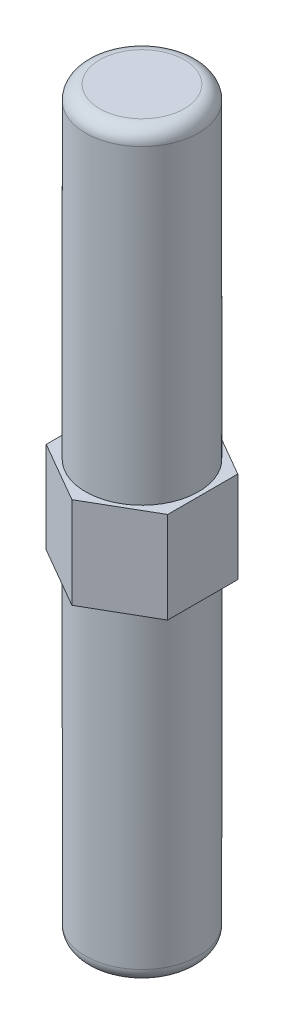
ISO-10303-21;
HEADER;
FILE_DESCRIPTION(('STEP AP214'),'2;1');
FILE_NAME('part.step','',(''),(''),'','','');
FILE_SCHEMA(('AUTOMOTIVE_DESIGN { 1 0 10303 214 1 1 1 1 }'));
ENDSEC;
DATA;
#1=APPLICATION_CONTEXT('core data for automotive mechanical design processes');
#2=APPLICATION_PROTOCOL_DEFINITION('international standard','automotive_design',2000,#1);
#3=PRODUCT_CONTEXT('',#1,'mechanical');
#4=PRODUCT('Part','Part','',(#3));
#5=PRODUCT_RELATED_PRODUCT_CATEGORY('part','',(#4));
#6=PRODUCT_DEFINITION_FORMATION('','',#4);
#7=PRODUCT_DEFINITION_CONTEXT('part definition',#1,'design');
#8=PRODUCT_DEFINITION('design','',#6,#7);
#9=PRODUCT_DEFINITION_SHAPE('','',#8);
#10=(LENGTH_UNIT() NAMED_UNIT(*) SI_UNIT(.MILLI.,.METRE.));
#11=(NAMED_UNIT(*) PLANE_ANGLE_UNIT() SI_UNIT($,.RADIAN.));
#12=(NAMED_UNIT(*) SI_UNIT($,.STERADIAN.) SOLID_ANGLE_UNIT());
#13=UNCERTAINTY_MEASURE_WITH_UNIT(LENGTH_MEASURE(1.E-05),#10,'distance_accuracy_value','');
#14=(GEOMETRIC_REPRESENTATION_CONTEXT(3) GLOBAL_UNCERTAINTY_ASSIGNED_CONTEXT((#13)) GLOBAL_UNIT_ASSIGNED_CONTEXT((#10,
#11,#12)) REPRESENTATION_CONTEXT('',''));
#15=CARTESIAN_POINT('',(0.,0.,0.));
#16=DIRECTION('',(0.,0.,1.));
#17=DIRECTION('',(1.,0.,0.));
#18=AXIS2_PLACEMENT_3D('',#15,#16,#17);
#19=CARTESIAN_POINT('',(-2.73050000000002,2.0574,1.57645491002226));
#20=DIRECTION('',(0.500000000000001,0.,-0.866025403784438));
#21=DIRECTION('',(-0.866025403784438,0.,-0.500000000000001));
#22=AXIS2_PLACEMENT_3D('',#19,#20,#21);
#23=PLANE('',#22);
#24=DIRECTION('',(0.866025403784438,0.,0.500000000000001));
#25=VECTOR('',#24,1.);
#26=CARTESIAN_POINT('',(-2.73050000000002,-2.0574,1.57645491002226));
#27=LINE('',#26,#25);
#28=CARTESIAN_POINT('',(-2.73050000000002,-2.0574,1.57645491002226));
#29=VERTEX_POINT('',#28);
#30=CARTESIAN_POINT('',(0.,-2.0574,3.15290982004454));
#31=VERTEX_POINT('',#30);
#32=EDGE_CURVE('E118',#29,#31,#27,.T.);
#33=ORIENTED_EDGE('',*,*,#32,.T.);
#34=DIRECTION('',(0.,-1.,0.));
#35=VECTOR('',#34,1.);
#36=CARTESIAN_POINT('',(0.,2.0574,3.15290982004454));
#37=LINE('',#36,#35);
#38=CARTESIAN_POINT('',(0.,2.0574,3.15290982004454));
#39=VERTEX_POINT('',#38);
#40=EDGE_CURVE('E136',#39,#31,#37,.T.);
#41=ORIENTED_EDGE('',*,*,#40,.F.);
#42=DIRECTION('',(0.866025403784438,0.,0.500000000000001));
#43=VECTOR('',#42,1.);
#44=CARTESIAN_POINT('',(-2.73050000000002,2.0574,1.57645491002226));
#45=LINE('',#44,#43);
#46=CARTESIAN_POINT('',(-2.73050000000002,2.0574,1.57645491002226));
#47=VERTEX_POINT('',#46);
#48=EDGE_CURVE('E129',#47,#39,#45,.T.);
#49=ORIENTED_EDGE('',*,*,#48,.F.);
#50=DIRECTION('',(0.,-1.,0.));
#51=VECTOR('',#50,1.);
#52=CARTESIAN_POINT('',(-2.73050000000002,2.0574,1.57645491002226));
#53=LINE('',#52,#51);
#54=EDGE_CURVE('E114',#47,#29,#53,.T.);
#55=ORIENTED_EDGE('',*,*,#54,.T.);
#56=EDGE_LOOP('',(#33,#41,#49,#55));
#57=FACE_BOUND('',#56,.T.);
#58=ADVANCED_FACE('F32',(#57),#23,.F.);
#59=CARTESIAN_POINT('',(0.,2.0574,3.15290982004454));
#60=DIRECTION('',(-0.500000000000002,0.,-0.866025403784438));
#61=DIRECTION('',(-0.866025403784438,0.,0.500000000000002));
#62=AXIS2_PLACEMENT_3D('',#59,#60,#61);
#63=PLANE('',#62);
#64=DIRECTION('',(0.866025403784437,0.,-0.500000000000002));
#65=VECTOR('',#64,1.);
#66=CARTESIAN_POINT('',(0.,-2.0574,3.15290982004454));
#67=LINE('',#66,#65);
#68=CARTESIAN_POINT('',(2.7305,-2.0574,1.57645491002226));
#69=VERTEX_POINT('',#68);
#70=EDGE_CURVE('E121',#31,#69,#67,.T.);
#71=ORIENTED_EDGE('',*,*,#70,.T.);
#72=DIRECTION('',(0.,-1.,0.));
#73=VECTOR('',#72,1.);
#74=CARTESIAN_POINT('',(2.7305,2.0574,1.57645491002226));
#75=LINE('',#74,#73);
#76=CARTESIAN_POINT('',(2.7305,2.0574,1.57645491002226));
#77=VERTEX_POINT('',#76);
#78=EDGE_CURVE('E133',#77,#69,#75,.T.);
#79=ORIENTED_EDGE('',*,*,#78,.F.);
#80=DIRECTION('',(0.866025403784437,0.,-0.500000000000002));
#81=VECTOR('',#80,1.);
#82=CARTESIAN_POINT('',(0.,2.0574,3.15290982004454));
#83=LINE('',#82,#81);
#84=EDGE_CURVE('E87',#39,#77,#83,.T.);
#85=ORIENTED_EDGE('',*,*,#84,.F.);
#86=ORIENTED_EDGE('',*,*,#40,.T.);
#87=EDGE_LOOP('',(#71,#79,#85,#86));
#88=FACE_BOUND('',#87,.T.);
#89=ADVANCED_FACE('F158',(#88),#63,.F.);
#90=CARTESIAN_POINT('',(2.7305,2.0574,1.57645491002226));
#91=DIRECTION('',(-1.,0.,0.));
#92=DIRECTION('',(0.,0.,1.));
#93=AXIS2_PLACEMENT_3D('',#90,#91,#92);
#94=PLANE('',#93);
#95=DIRECTION('',(0.,0.,-1.));
#96=VECTOR('',#95,1.);
#97=CARTESIAN_POINT('',(2.7305,-2.0574,1.57645491002226));
#98=LINE('',#97,#96);
#99=CARTESIAN_POINT('',(2.7305,-2.0574,-1.57645491002227));
#100=VERTEX_POINT('',#99);
#101=EDGE_CURVE('E124',#69,#100,#98,.T.);
#102=ORIENTED_EDGE('',*,*,#101,.T.);
#103=DIRECTION('',(0.,-1.,0.));
#104=VECTOR('',#103,1.);
#105=CARTESIAN_POINT('',(2.7305,2.0574,-1.57645491002227));
#106=LINE('',#105,#104);
#107=CARTESIAN_POINT('',(2.7305,2.0574,-1.57645491002227));
#108=VERTEX_POINT('',#107);
#109=EDGE_CURVE('E109',#108,#100,#106,.T.);
#110=ORIENTED_EDGE('',*,*,#109,.F.);
#111=DIRECTION('',(0.,0.,-1.));
#112=VECTOR('',#111,1.);
#113=CARTESIAN_POINT('',(2.7305,2.0574,1.57645491002226));
#114=LINE('',#113,#112);
#115=EDGE_CURVE('E100',#77,#108,#114,.T.);
#116=ORIENTED_EDGE('',*,*,#115,.F.);
#117=ORIENTED_EDGE('',*,*,#78,.T.);
#118=EDGE_LOOP('',(#102,#110,#116,#117));
#119=FACE_BOUND('',#118,.T.);
#120=ADVANCED_FACE('F164',(#119),#94,.F.);
#121=CARTESIAN_POINT('',(2.7305,2.0574,-1.57645491002227));
#122=DIRECTION('',(-0.5,0.,0.866025403784439));
#123=DIRECTION('',(0.866025403784439,0.,0.5));
#124=AXIS2_PLACEMENT_3D('',#121,#122,#123);
#125=PLANE('',#124);
#126=DIRECTION('',(-0.866025403784439,0.,-0.5));
#127=VECTOR('',#126,1.);
#128=CARTESIAN_POINT('',(2.7305,-2.0574,-1.57645491002227));
#129=LINE('',#128,#127);
#130=CARTESIAN_POINT('',(0.,-2.0574,-3.15290982004454));
#131=VERTEX_POINT('',#130);
#132=EDGE_CURVE('E108',#100,#131,#129,.T.);
#133=ORIENTED_EDGE('',*,*,#132,.T.);
#134=DIRECTION('',(0.,-1.,0.));
#135=VECTOR('',#134,1.);
#136=CARTESIAN_POINT('',(0.,2.0574,-3.15290982004454));
#137=LINE('',#136,#135);
#138=CARTESIAN_POINT('',(0.,2.0574,-3.15290982004454));
#139=VERTEX_POINT('',#138);
#140=EDGE_CURVE('E105',#139,#131,#137,.T.);
#141=ORIENTED_EDGE('',*,*,#140,.F.);
#142=DIRECTION('',(-0.866025403784439,0.,-0.5));
#143=VECTOR('',#142,1.);
#144=CARTESIAN_POINT('',(2.7305,2.0574,-1.57645491002227));
#145=LINE('',#144,#143);
#146=EDGE_CURVE('E94',#108,#139,#145,.T.);
#147=ORIENTED_EDGE('',*,*,#146,.F.);
#148=ORIENTED_EDGE('',*,*,#109,.T.);
#149=EDGE_LOOP('',(#133,#141,#147,#148));
#150=FACE_BOUND('',#149,.T.);
#151=ADVANCED_FACE('F106',(#150),#125,.F.);
#152=CARTESIAN_POINT('',(0.,2.0574,-3.15290982004454));
#153=DIRECTION('',(0.5,0.,0.866025403784439));
#154=DIRECTION('',(0.866025403784439,0.,-0.5));
#155=AXIS2_PLACEMENT_3D('',#152,#153,#154);
#156=PLANE('',#155);
#157=DIRECTION('',(-0.866025403784438,0.,0.5));
#158=VECTOR('',#157,1.);
#159=CARTESIAN_POINT('',(0.,-2.0574,-3.15290982004454));
#160=LINE('',#159,#158);
#161=CARTESIAN_POINT('',(-2.7305,-2.0574,-1.57645491002227));
#162=VERTEX_POINT('',#161);
#163=EDGE_CURVE('E72',#131,#162,#160,.T.);
#164=ORIENTED_EDGE('',*,*,#163,.T.);
#165=DIRECTION('',(0.,-1.,0.));
#166=VECTOR('',#165,1.);
#167=CARTESIAN_POINT('',(-2.7305,2.0574,-1.57645491002227));
#168=LINE('',#167,#166);
#169=CARTESIAN_POINT('',(-2.7305,2.0574,-1.57645491002227));
#170=VERTEX_POINT('',#169);
#171=EDGE_CURVE('E110',#170,#162,#168,.T.);
#172=ORIENTED_EDGE('',*,*,#171,.F.);
#173=DIRECTION('',(-0.866025403784438,0.,0.5));
#174=VECTOR('',#173,1.);
#175=CARTESIAN_POINT('',(0.,2.0574,-3.15290982004454));
#176=LINE('',#175,#174);
#177=EDGE_CURVE('E98',#139,#170,#176,.T.);
#178=ORIENTED_EDGE('',*,*,#177,.F.);
#179=ORIENTED_EDGE('',*,*,#140,.T.);
#180=EDGE_LOOP('',(#164,#172,#178,#179));
#181=FACE_BOUND('',#180,.T.);
#182=ADVANCED_FACE('F112',(#181),#156,.F.);
#183=CARTESIAN_POINT('',(-2.7305,2.0574,-1.57645491002227));
#184=DIRECTION('',(1.,0.,0.));
#185=DIRECTION('',(0.,0.,-1.));
#186=AXIS2_PLACEMENT_3D('',#183,#184,#185);
#187=PLANE('',#186);
#188=DIRECTION('',(0.,0.,1.));
#189=VECTOR('',#188,1.);
#190=CARTESIAN_POINT('',(-2.7305,-2.0574,-1.57645491002227));
#191=LINE('',#190,#189);
#192=EDGE_CURVE('E78',#162,#29,#191,.T.);
#193=ORIENTED_EDGE('',*,*,#192,.T.);
#194=ORIENTED_EDGE('',*,*,#54,.F.);
#195=DIRECTION('',(0.,0.,1.));
#196=VECTOR('',#195,1.);
#197=CARTESIAN_POINT('',(-2.7305,2.0574,-1.57645491002227));
#198=LINE('',#197,#196);
#199=EDGE_CURVE('E49',#170,#47,#198,.T.);
#200=ORIENTED_EDGE('',*,*,#199,.F.);
#201=ORIENTED_EDGE('',*,*,#171,.T.);
#202=EDGE_LOOP('',(#193,#194,#200,#201));
#203=FACE_BOUND('',#202,.T.);
#204=ADVANCED_FACE('F174',(#203),#187,.F.);
#205=CARTESIAN_POINT('',(0.,2.0574,0.));
#206=DIRECTION('',(0.,1.,0.));
#207=DIRECTION('',(0.,0.,1.));
#208=AXIS2_PLACEMENT_3D('',#205,#206,#207);
#209=PLANE('',#208);
#210=CARTESIAN_POINT('',(0.,2.0574,0.));
#211=DIRECTION('',(0.,1.,0.));
#212=DIRECTION('',(0.,0.,1.));
#213=AXIS2_PLACEMENT_3D('',#210,#211,#212);
#214=CIRCLE('',#213,2.54);
#215=CARTESIAN_POINT('',(0.,2.0574,-2.54));
#216=VERTEX_POINT('',#215);
#217=EDGE_CURVE('E122',#216,#216,#214,.T.);
#218=ORIENTED_EDGE('',*,*,#217,.F.);
#219=EDGE_LOOP('',(#218));
#220=FACE_BOUND('',#219,.T.);
#221=ORIENTED_EDGE('',*,*,#48,.T.);
#222=ORIENTED_EDGE('',*,*,#84,.T.);
#223=ORIENTED_EDGE('',*,*,#115,.T.);
#224=ORIENTED_EDGE('',*,*,#146,.T.);
#225=ORIENTED_EDGE('',*,*,#177,.T.);
#226=ORIENTED_EDGE('',*,*,#199,.T.);
#227=EDGE_LOOP('',(#221,#222,#223,#224,#225,#226));
#228=FACE_BOUND('',#227,.T.);
#229=ADVANCED_FACE('F96',(#220,#228),#209,.T.);
#230=CARTESIAN_POINT('',(0.,-2.0574,0.));
#231=DIRECTION('',(0.,1.,0.));
#232=DIRECTION('',(0.,0.,1.));
#233=AXIS2_PLACEMENT_3D('',#230,#231,#232);
#234=PLANE('',#233);
#235=CARTESIAN_POINT('',(0.,-2.0574,0.));
#236=DIRECTION('',(0.,1.,0.));
#237=DIRECTION('',(0.,0.,1.));
#238=AXIS2_PLACEMENT_3D('',#235,#236,#237);
#239=CIRCLE('',#238,2.54);
#240=CARTESIAN_POINT('',(0.,-2.0574,2.54));
#241=VERTEX_POINT('',#240);
#242=EDGE_CURVE('E204',#241,#241,#239,.T.);
#243=ORIENTED_EDGE('',*,*,#242,.T.);
#244=EDGE_LOOP('',(#243));
#245=FACE_BOUND('',#244,.T.);
#246=ORIENTED_EDGE('',*,*,#32,.F.);
#247=ORIENTED_EDGE('',*,*,#192,.F.);
#248=ORIENTED_EDGE('',*,*,#163,.F.);
#249=ORIENTED_EDGE('',*,*,#132,.F.);
#250=ORIENTED_EDGE('',*,*,#101,.F.);
#251=ORIENTED_EDGE('',*,*,#70,.F.);
#252=EDGE_LOOP('',(#246,#247,#248,#249,#250,#251));
#253=FACE_BOUND('',#252,.T.);
#254=ADVANCED_FACE('F177',(#245,#253),#234,.F.);
#255=CARTESIAN_POINT('',(0.,16.6624,0.));
#256=DIRECTION('',(0.,-1.,0.));
#257=DIRECTION('',(0.,0.,-1.));
#258=AXIS2_PLACEMENT_3D('',#255,#256,#257);
#259=CYLINDRICAL_SURFACE('',#258,2.54);
#260=CARTESIAN_POINT('',(0.,16.0274,0.));
#261=DIRECTION('',(0.,1.,0.));
#262=DIRECTION('',(0.,0.,1.));
#263=AXIS2_PLACEMENT_3D('',#260,#261,#262);
#264=CIRCLE('',#263,2.54);
#265=CARTESIAN_POINT('',(0.,16.0274,-2.54));
#266=VERTEX_POINT('',#265);
#267=EDGE_CURVE('E11',#266,#266,#264,.F.);
#268=CARTESIAN_POINT('',(0.,16.0274,-2.54));
#269=CARTESIAN_POINT('',(0.,15.8818791666667,-2.54));
#270=CARTESIAN_POINT('',(0.,15.7363583333333,-2.54));
#271=CARTESIAN_POINT('',(0.,15.4453166666667,-2.54));
#272=CARTESIAN_POINT('',(0.,15.2997958333333,-2.54));
#273=CARTESIAN_POINT('',(0.,15.0087541666667,-2.54));
#274=CARTESIAN_POINT('',(0.,14.8632333333333,-2.54));
#275=CARTESIAN_POINT('',(0.,14.5721916666667,-2.54));
#276=CARTESIAN_POINT('',(0.,14.4266708333333,-2.54));
#277=CARTESIAN_POINT('',(0.,14.1356291666667,-2.54));
#278=CARTESIAN_POINT('',(0.,13.9901083333333,-2.54));
#279=CARTESIAN_POINT('',(0.,13.6990666666667,-2.54));
#280=CARTESIAN_POINT('',(0.,13.5535458333333,-2.54));
#281=CARTESIAN_POINT('',(0.,13.2625041666667,-2.54));
#282=CARTESIAN_POINT('',(0.,13.1169833333333,-2.54));
#283=CARTESIAN_POINT('',(0.,12.8259416666667,-2.54));
#284=CARTESIAN_POINT('',(0.,12.6804208333333,-2.54));
#285=CARTESIAN_POINT('',(0.,12.3893791666667,-2.54));
#286=CARTESIAN_POINT('',(0.,12.2438583333333,-2.54));
#287=CARTESIAN_POINT('',(0.,11.9528166666667,-2.54));
#288=CARTESIAN_POINT('',(0.,11.8072958333333,-2.54));
#289=CARTESIAN_POINT('',(0.,11.5162541666667,-2.54));
#290=CARTESIAN_POINT('',(0.,11.3707333333333,-2.54));
#291=CARTESIAN_POINT('',(0.,11.0796916666667,-2.54));
#292=CARTESIAN_POINT('',(0.,10.9341708333333,-2.54));
#293=CARTESIAN_POINT('',(0.,10.6431291666667,-2.54));
#294=CARTESIAN_POINT('',(0.,10.4976083333333,-2.54));
#295=CARTESIAN_POINT('',(0.,10.2065666666667,-2.54));
#296=CARTESIAN_POINT('',(0.,10.0610458333333,-2.54));
#297=CARTESIAN_POINT('',(0.,9.77000416666666,-2.54));
#298=CARTESIAN_POINT('',(0.,9.62448333333333,-2.54));
#299=CARTESIAN_POINT('',(0.,9.33344166666666,-2.54));
#300=CARTESIAN_POINT('',(0.,9.18792083333333,-2.54));
#301=CARTESIAN_POINT('',(0.,8.89687916666666,-2.54));
#302=CARTESIAN_POINT('',(0.,8.75135833333333,-2.54));
#303=CARTESIAN_POINT('',(0.,8.46031666666667,-2.54));
#304=CARTESIAN_POINT('',(0.,8.31479583333333,-2.54));
#305=CARTESIAN_POINT('',(0.,8.02375416666667,-2.54));
#306=CARTESIAN_POINT('',(0.,7.87823333333333,-2.54));
#307=CARTESIAN_POINT('',(0.,7.58719166666667,-2.54));
#308=CARTESIAN_POINT('',(0.,7.44167083333333,-2.54));
#309=CARTESIAN_POINT('',(0.,7.15062916666666,-2.54));
#310=CARTESIAN_POINT('',(0.,7.00510833333333,-2.54));
#311=CARTESIAN_POINT('',(0.,6.71406666666666,-2.54));
#312=CARTESIAN_POINT('',(0.,6.56854583333333,-2.54));
#313=CARTESIAN_POINT('',(0.,6.27750416666667,-2.54));
#314=CARTESIAN_POINT('',(0.,6.13198333333333,-2.54));
#315=CARTESIAN_POINT('',(0.,5.84094166666667,-2.54));
#316=CARTESIAN_POINT('',(0.,5.69542083333333,-2.54));
#317=CARTESIAN_POINT('',(0.,5.40437916666666,-2.54));
#318=CARTESIAN_POINT('',(0.,5.25885833333333,-2.54));
#319=CARTESIAN_POINT('',(0.,4.96781666666666,-2.54));
#320=CARTESIAN_POINT('',(0.,4.82229583333333,-2.54));
#321=CARTESIAN_POINT('',(0.,4.53125416666667,-2.54));
#322=CARTESIAN_POINT('',(0.,4.38573333333333,-2.54));
#323=CARTESIAN_POINT('',(0.,4.09469166666667,-2.54));
#324=CARTESIAN_POINT('',(0.,3.94917083333333,-2.54));
#325=CARTESIAN_POINT('',(0.,3.65812916666667,-2.54));
#326=CARTESIAN_POINT('',(0.,3.51260833333333,-2.54));
#327=CARTESIAN_POINT('',(0.,3.22156666666667,-2.54));
#328=CARTESIAN_POINT('',(0.,3.07604583333333,-2.54));
#329=CARTESIAN_POINT('',(0.,2.78500416666667,-2.54));
#330=CARTESIAN_POINT('',(0.,2.63948333333333,-2.54));
#331=CARTESIAN_POINT('',(0.,2.34844166666667,-2.54));
#332=CARTESIAN_POINT('',(0.,2.20292083333333,-2.54));
#333=CARTESIAN_POINT('',(0.,2.0574,-2.54));
#334=B_SPLINE_CURVE_WITH_KNOTS('',3,(#268,#269,#270,#271,#272,#273,#274,#275,#276,#277,#278,
#279,#280,#281,#282,#283,#284,#285,#286,#287,#288,#289,#290,#291,#292,#293,#294,#295,#296,#297,
#298,#299,#300,#301,#302,#303,#304,#305,#306,#307,#308,#309,#310,#311,#312,#313,#314,#315,#316,
#317,#318,#319,#320,#321,#322,#323,#324,#325,#326,#327,#328,#329,#330,#331,#332,#333),
.UNSPECIFIED.,.F.,.F.,(4,2,2,2,2,2,2,2,2,2,2,2,2,2,2,2,2,2,2,2,2,2,2,2,2,2,2,2,2,2,2,2,4),(0.,
0.436562499999998,0.873124999999999,1.3096875,1.74625,2.1828125,2.619375,3.0559375,3.4925,
3.9290625,4.365625,4.8021875,5.23875,5.6753125,6.111875,6.5484375,6.985,7.4215625,
7.85812499999999,8.29468749999999,8.73125,9.16781249999999,9.604375,10.0409375,10.4775,
10.9140625,11.350625,11.7871875,12.22375,12.6603125,13.096875,13.5334375,13.97),.UNSPECIFIED.);
#335=EDGE_CURVE('BSEAM180',#266,#216,#334,.T.);
#336=ORIENTED_EDGE('',*,*,#267,.T.);
#337=ORIENTED_EDGE('',*,*,#217,.T.);
#338=ORIENTED_EDGE('',*,*,#335,.T.);
#339=ORIENTED_EDGE('',*,*,#335,.F.);
#340=EDGE_LOOP('',(#336,#338,#337,#339));
#341=FACE_BOUND('',#340,.T.);
#342=ADVANCED_FACE('F180',(#341),#259,.T.);
#343=CARTESIAN_POINT('',(0.,16.6624,0.));
#344=DIRECTION('',(0.,1.,0.));
#345=DIRECTION('',(0.,0.,1.));
#346=AXIS2_PLACEMENT_3D('',#343,#344,#345);
#347=PLANE('',#346);
#348=CARTESIAN_POINT('',(0.,16.6624,0.));
#349=DIRECTION('',(0.,1.,0.));
#350=DIRECTION('',(0.,0.,1.));
#351=AXIS2_PLACEMENT_3D('',#348,#349,#350);
#352=CIRCLE('',#351,1.905);
#353=CARTESIAN_POINT('',(0.,16.6624,1.905));
#354=VERTEX_POINT('',#353);
#355=EDGE_CURVE('E41',#354,#354,#352,.T.);
#356=ORIENTED_EDGE('',*,*,#355,.T.);
#357=EDGE_LOOP('',(#356));
#358=FACE_BOUND('',#357,.T.);
#359=ADVANCED_FACE('F146',(#358),#347,.T.);
#360=CARTESIAN_POINT('',(0.,-16.6624,0.));
#361=DIRECTION('',(0.,1.,0.));
#362=DIRECTION('',(0.,0.,1.));
#363=AXIS2_PLACEMENT_3D('',#360,#361,#362);
#364=CYLINDRICAL_SURFACE('',#363,2.54);
#365=CARTESIAN_POINT('',(0.,-16.0274,0.));
#366=DIRECTION('',(0.,-1.,0.));
#367=DIRECTION('',(0.,0.,-1.));
#368=AXIS2_PLACEMENT_3D('',#365,#366,#367);
#369=CIRCLE('',#368,2.54);
#370=CARTESIAN_POINT('',(0.,-16.0274,2.54));
#371=VERTEX_POINT('',#370);
#372=EDGE_CURVE('E138',#371,#371,#369,.F.);
#373=CARTESIAN_POINT('',(0.,-16.0274,2.54));
#374=CARTESIAN_POINT('',(0.,-15.8818791666667,2.54));
#375=CARTESIAN_POINT('',(0.,-15.7363583333333,2.54));
#376=CARTESIAN_POINT('',(0.,-15.4453166666667,2.54));
#377=CARTESIAN_POINT('',(0.,-15.2997958333333,2.54));
#378=CARTESIAN_POINT('',(0.,-15.0087541666667,2.54));
#379=CARTESIAN_POINT('',(0.,-14.8632333333333,2.54));
#380=CARTESIAN_POINT('',(0.,-14.5721916666667,2.54));
#381=CARTESIAN_POINT('',(0.,-14.4266708333333,2.54));
#382=CARTESIAN_POINT('',(0.,-14.1356291666667,2.54));
#383=CARTESIAN_POINT('',(0.,-13.9901083333333,2.54));
#384=CARTESIAN_POINT('',(0.,-13.6990666666667,2.54));
#385=CARTESIAN_POINT('',(0.,-13.5535458333333,2.54));
#386=CARTESIAN_POINT('',(0.,-13.2625041666667,2.54));
#387=CARTESIAN_POINT('',(0.,-13.1169833333333,2.54));
#388=CARTESIAN_POINT('',(0.,-12.8259416666667,2.54));
#389=CARTESIAN_POINT('',(0.,-12.6804208333333,2.54));
#390=CARTESIAN_POINT('',(0.,-12.3893791666667,2.54));
#391=CARTESIAN_POINT('',(0.,-12.2438583333333,2.54));
#392=CARTESIAN_POINT('',(0.,-11.9528166666667,2.54));
#393=CARTESIAN_POINT('',(0.,-11.8072958333333,2.54));
#394=CARTESIAN_POINT('',(0.,-11.5162541666667,2.54));
#395=CARTESIAN_POINT('',(0.,-11.3707333333333,2.54));
#396=CARTESIAN_POINT('',(0.,-11.0796916666667,2.54));
#397=CARTESIAN_POINT('',(0.,-10.9341708333333,2.54));
#398=CARTESIAN_POINT('',(0.,-10.6431291666667,2.54));
#399=CARTESIAN_POINT('',(0.,-10.4976083333333,2.54));
#400=CARTESIAN_POINT('',(0.,-10.2065666666667,2.54));
#401=CARTESIAN_POINT('',(0.,-10.0610458333333,2.54));
#402=CARTESIAN_POINT('',(0.,-9.77000416666666,2.54));
#403=CARTESIAN_POINT('',(0.,-9.62448333333333,2.54));
#404=CARTESIAN_POINT('',(0.,-9.33344166666666,2.54));
#405=CARTESIAN_POINT('',(0.,-9.18792083333333,2.54));
#406=CARTESIAN_POINT('',(0.,-8.89687916666666,2.54));
#407=CARTESIAN_POINT('',(0.,-8.75135833333333,2.54));
#408=CARTESIAN_POINT('',(0.,-8.46031666666667,2.54));
#409=CARTESIAN_POINT('',(0.,-8.31479583333333,2.54));
#410=CARTESIAN_POINT('',(0.,-8.02375416666667,2.54));
#411=CARTESIAN_POINT('',(0.,-7.87823333333333,2.54));
#412=CARTESIAN_POINT('',(0.,-7.58719166666667,2.54));
#413=CARTESIAN_POINT('',(0.,-7.44167083333333,2.54));
#414=CARTESIAN_POINT('',(0.,-7.15062916666666,2.54));
#415=CARTESIAN_POINT('',(0.,-7.00510833333333,2.54));
#416=CARTESIAN_POINT('',(0.,-6.71406666666666,2.54));
#417=CARTESIAN_POINT('',(0.,-6.56854583333333,2.54));
#418=CARTESIAN_POINT('',(0.,-6.27750416666667,2.54));
#419=CARTESIAN_POINT('',(0.,-6.13198333333333,2.54));
#420=CARTESIAN_POINT('',(0.,-5.84094166666667,2.54));
#421=CARTESIAN_POINT('',(0.,-5.69542083333333,2.54));
#422=CARTESIAN_POINT('',(0.,-5.40437916666666,2.54));
#423=CARTESIAN_POINT('',(0.,-5.25885833333333,2.54));
#424=CARTESIAN_POINT('',(0.,-4.96781666666666,2.54));
#425=CARTESIAN_POINT('',(0.,-4.82229583333333,2.54));
#426=CARTESIAN_POINT('',(0.,-4.53125416666667,2.54));
#427=CARTESIAN_POINT('',(0.,-4.38573333333333,2.54));
#428=CARTESIAN_POINT('',(0.,-4.09469166666667,2.54));
#429=CARTESIAN_POINT('',(0.,-3.94917083333333,2.54));
#430=CARTESIAN_POINT('',(0.,-3.65812916666667,2.54));
#431=CARTESIAN_POINT('',(0.,-3.51260833333333,2.54));
#432=CARTESIAN_POINT('',(0.,-3.22156666666667,2.54));
#433=CARTESIAN_POINT('',(0.,-3.07604583333333,2.54));
#434=CARTESIAN_POINT('',(0.,-2.78500416666667,2.54));
#435=CARTESIAN_POINT('',(0.,-2.63948333333333,2.54));
#436=CARTESIAN_POINT('',(0.,-2.34844166666667,2.54));
#437=CARTESIAN_POINT('',(0.,-2.20292083333333,2.54));
#438=CARTESIAN_POINT('',(0.,-2.0574,2.54));
#439=B_SPLINE_CURVE_WITH_KNOTS('',3,(#373,#374,#375,#376,#377,#378,#379,#380,#381,#382,#383,
#384,#385,#386,#387,#388,#389,#390,#391,#392,#393,#394,#395,#396,#397,#398,#399,#400,#401,#402,
#403,#404,#405,#406,#407,#408,#409,#410,#411,#412,#413,#414,#415,#416,#417,#418,#419,#420,#421,
#422,#423,#424,#425,#426,#427,#428,#429,#430,#431,#432,#433,#434,#435,#436,#437,#438),
.UNSPECIFIED.,.F.,.F.,(4,2,2,2,2,2,2,2,2,2,2,2,2,2,2,2,2,2,2,2,2,2,2,2,2,2,2,2,2,2,2,2,4),(0.,
0.436562499999998,0.873124999999999,1.3096875,1.74625,2.1828125,2.619375,3.0559375,3.4925,
3.9290625,4.365625,4.8021875,5.23875,5.6753125,6.111875,6.5484375,6.985,7.4215625,
7.85812499999999,8.29468749999999,8.73125,9.16781249999999,9.604375,10.0409375,10.4775,
10.9140625,11.350625,11.7871875,12.22375,12.6603125,13.096875,13.5334375,13.97),.UNSPECIFIED.);
#440=EDGE_CURVE('BSEAM190',#371,#241,#439,.T.);
#441=ORIENTED_EDGE('',*,*,#372,.T.);
#442=ORIENTED_EDGE('',*,*,#242,.F.);
#443=ORIENTED_EDGE('',*,*,#440,.T.);
#444=ORIENTED_EDGE('',*,*,#440,.F.);
#445=EDGE_LOOP('',(#441,#443,#442,#444));
#446=FACE_BOUND('',#445,.T.);
#447=ADVANCED_FACE('F190',(#446),#364,.T.);
#448=CARTESIAN_POINT('',(0.,-16.6624,0.));
#449=DIRECTION('',(0.,-1.,0.));
#450=DIRECTION('',(0.,0.,1.));
#451=AXIS2_PLACEMENT_3D('',#448,#449,#450);
#452=PLANE('',#451);
#453=CARTESIAN_POINT('',(0.,-16.6624,0.));
#454=DIRECTION('',(0.,-1.,0.));
#455=DIRECTION('',(0.,0.,-1.));
#456=AXIS2_PLACEMENT_3D('',#453,#454,#455);
#457=CIRCLE('',#456,1.905);
#458=CARTESIAN_POINT('',(0.,-16.6624,-1.905));
#459=VERTEX_POINT('',#458);
#460=EDGE_CURVE('E141',#459,#459,#457,.T.);
#461=ORIENTED_EDGE('',*,*,#460,.T.);
#462=EDGE_LOOP('',(#461));
#463=FACE_BOUND('',#462,.T.);
#464=ADVANCED_FACE('F154',(#463),#452,.T.);
#465=CARTESIAN_POINT('',(0.,-16.0274,0.));
#466=DIRECTION('',(0.,-1.,0.));
#467=DIRECTION('',(0.,0.,-1.));
#468=AXIS2_PLACEMENT_3D('',#465,#466,#467);
#469=TOROIDAL_SURFACE('',#468,1.905,0.635);
#470=ORIENTED_EDGE('',*,*,#460,.F.);
#471=EDGE_LOOP('',(#470));
#472=FACE_BOUND('',#471,.T.);
#473=ORIENTED_EDGE('',*,*,#372,.F.);
#474=EDGE_LOOP('',(#473));
#475=FACE_BOUND('',#474,.T.);
#476=ADVANCED_FACE('F149',(#472,#475),#469,.T.);
#477=CARTESIAN_POINT('',(0.,16.0274,0.));
#478=DIRECTION('',(0.,1.,0.));
#479=DIRECTION('',(0.,0.,1.));
#480=AXIS2_PLACEMENT_3D('',#477,#478,#479);
#481=TOROIDAL_SURFACE('',#480,1.905,0.635);
#482=ORIENTED_EDGE('',*,*,#267,.F.);
#483=EDGE_LOOP('',(#482));
#484=FACE_BOUND('',#483,.T.);
#485=ORIENTED_EDGE('',*,*,#355,.F.);
#486=EDGE_LOOP('',(#485));
#487=FACE_BOUND('',#486,.T.);
#488=ADVANCED_FACE('F34',(#484,#487),#481,.T.);
#489=CLOSED_SHELL('',(#58,#89,#120,#151,#182,#204,#229,#254,#342,#359,#447,#464,#476,#488));
#490=MANIFOLD_SOLID_BREP('B2',#489);
#491=ADVANCED_BREP_SHAPE_REPRESENTATION('',(#18,#490),#14);
#492=SHAPE_DEFINITION_REPRESENTATION(#9,#491);
ENDSEC;
END-ISO-10303-21;
